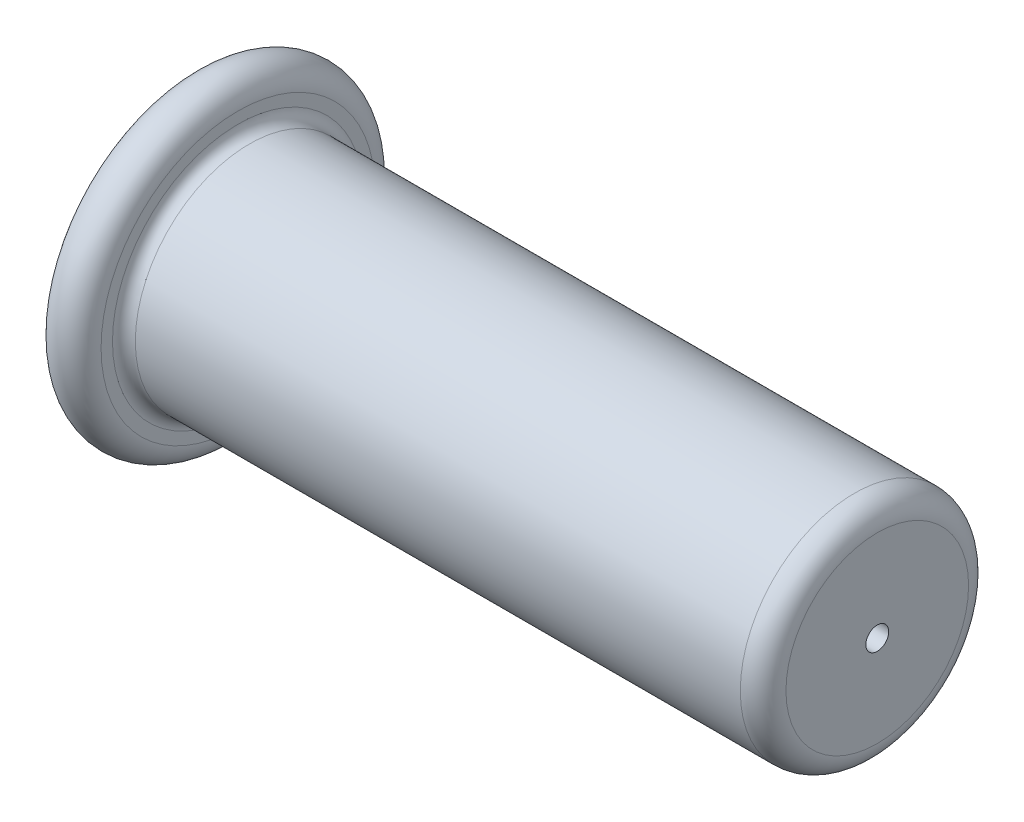
ISO-10303-21;
HEADER;
FILE_DESCRIPTION(('STEP AP214'),'2;1');
FILE_NAME('part.step','',(''),(''),'','','');
FILE_SCHEMA(('AUTOMOTIVE_DESIGN { 1 0 10303 214 1 1 1 1 }'));
ENDSEC;
DATA;
#1=APPLICATION_CONTEXT('core data for automotive mechanical design processes');
#2=APPLICATION_PROTOCOL_DEFINITION('international standard','automotive_design',2000,#1);
#3=PRODUCT_CONTEXT('',#1,'mechanical');
#4=PRODUCT('Part','Part','',(#3));
#5=PRODUCT_RELATED_PRODUCT_CATEGORY('part','',(#4));
#6=PRODUCT_DEFINITION_FORMATION('','',#4);
#7=PRODUCT_DEFINITION_CONTEXT('part definition',#1,'design');
#8=PRODUCT_DEFINITION('design','',#6,#7);
#9=PRODUCT_DEFINITION_SHAPE('','',#8);
#10=(LENGTH_UNIT() NAMED_UNIT(*) SI_UNIT(.MILLI.,.METRE.));
#11=(NAMED_UNIT(*) PLANE_ANGLE_UNIT() SI_UNIT($,.RADIAN.));
#12=(NAMED_UNIT(*) SI_UNIT($,.STERADIAN.) SOLID_ANGLE_UNIT());
#13=UNCERTAINTY_MEASURE_WITH_UNIT(LENGTH_MEASURE(1.E-05),#10,'distance_accuracy_value','');
#14=(GEOMETRIC_REPRESENTATION_CONTEXT(3) GLOBAL_UNCERTAINTY_ASSIGNED_CONTEXT((#13)) GLOBAL_UNIT_ASSIGNED_CONTEXT((#10,
#11,#12)) REPRESENTATION_CONTEXT('',''));
#15=CARTESIAN_POINT('',(0.,0.,0.));
#16=DIRECTION('',(0.,0.,1.));
#17=DIRECTION('',(1.,0.,0.));
#18=AXIS2_PLACEMENT_3D('',#15,#16,#17);
#19=CARTESIAN_POINT('',(10.,0.,0.));
#20=DIRECTION('',(-1.,0.,0.));
#21=DIRECTION('',(0.,0.,1.));
#22=AXIS2_PLACEMENT_3D('',#19,#20,#21);
#23=TOROIDAL_SURFACE('',#22,22.,2.);
#24=CARTESIAN_POINT('',(9.99999999999999,0.,0.));
#25=DIRECTION('',(-1.,0.,0.));
#26=DIRECTION('',(0.,0.,1.));
#27=AXIS2_PLACEMENT_3D('',#24,#25,#26);
#28=CIRCLE('',#27,20.);
#29=CARTESIAN_POINT('',(9.99999999999999,0.,20.));
#30=VERTEX_POINT('',#29);
#31=EDGE_CURVE('E71',#30,#30,#28,.T.);
#32=ORIENTED_EDGE('',*,*,#31,.T.);
#33=EDGE_LOOP('',(#32));
#34=FACE_BOUND('',#33,.T.);
#35=CARTESIAN_POINT('',(7.99999999999999,0.,0.));
#36=DIRECTION('',(-1.,0.,0.));
#37=DIRECTION('',(0.,0.,1.));
#38=AXIS2_PLACEMENT_3D('',#35,#36,#37);
#39=CIRCLE('',#38,22.);
#40=CARTESIAN_POINT('',(7.99999999999999,0.,22.));
#41=VERTEX_POINT('',#40);
#42=EDGE_CURVE('E10',#41,#41,#39,.T.);
#43=ORIENTED_EDGE('',*,*,#42,.F.);
#44=EDGE_LOOP('',(#43));
#45=FACE_BOUND('',#44,.T.);
#46=ADVANCED_FACE('F34',(#34,#45),#23,.F.);
#47=CARTESIAN_POINT('',(7.99999999999999,0.,0.));
#48=DIRECTION('',(1.,0.,0.));
#49=DIRECTION('',(0.,0.,-1.));
#50=AXIS2_PLACEMENT_3D('',#47,#48,#49);
#51=PLANE('',#50);
#52=ORIENTED_EDGE('',*,*,#42,.T.);
#53=EDGE_LOOP('',(#52));
#54=FACE_BOUND('',#53,.T.);
#55=CARTESIAN_POINT('',(7.99999999999999,0.,0.));
#56=DIRECTION('',(-1.,0.,0.));
#57=DIRECTION('',(0.,0.,1.));
#58=AXIS2_PLACEMENT_3D('',#55,#56,#57);
#59=CIRCLE('',#58,24.);
#60=CARTESIAN_POINT('',(7.99999999999999,0.,24.));
#61=VERTEX_POINT('',#60);
#62=EDGE_CURVE('E40',#61,#61,#59,.T.);
#63=ORIENTED_EDGE('',*,*,#62,.F.);
#64=EDGE_LOOP('',(#63));
#65=FACE_BOUND('',#64,.T.);
#66=ADVANCED_FACE('F107',(#54,#65),#51,.T.);
#67=CARTESIAN_POINT('',(4.,0.,0.));
#68=DIRECTION('',(-1.,0.,0.));
#69=DIRECTION('',(0.,0.,1.));
#70=AXIS2_PLACEMENT_3D('',#67,#68,#69);
#71=TOROIDAL_SURFACE('',#70,24.,4.);
#72=ORIENTED_EDGE('',*,*,#62,.T.);
#73=EDGE_LOOP('',(#72));
#74=FACE_BOUND('',#73,.T.);
#75=CARTESIAN_POINT('',(0.,0.,0.));
#76=DIRECTION('',(-1.,0.,0.));
#77=DIRECTION('',(0.,0.,1.));
#78=AXIS2_PLACEMENT_3D('',#75,#76,#77);
#79=CIRCLE('',#78,24.);
#80=CARTESIAN_POINT('',(0.,0.,24.));
#81=VERTEX_POINT('',#80);
#82=EDGE_CURVE('E44',#81,#81,#79,.T.);
#83=ORIENTED_EDGE('',*,*,#82,.F.);
#84=EDGE_LOOP('',(#83));
#85=FACE_BOUND('',#84,.T.);
#86=ADVANCED_FACE('F111',(#74,#85),#71,.T.);
#87=CARTESIAN_POINT('',(0.,0.,0.));
#88=DIRECTION('',(-1.,0.,0.));
#89=DIRECTION('',(0.,0.,1.));
#90=AXIS2_PLACEMENT_3D('',#87,#88,#89);
#91=PLANE('',#90);
#92=ORIENTED_EDGE('',*,*,#82,.T.);
#93=EDGE_LOOP('',(#92));
#94=FACE_BOUND('',#93,.T.);
#95=CARTESIAN_POINT('',(0.,0.,0.));
#96=DIRECTION('',(-1.,0.,0.));
#97=DIRECTION('',(0.,0.,1.));
#98=AXIS2_PLACEMENT_3D('',#95,#96,#97);
#99=CIRCLE('',#98,13.);
#100=CARTESIAN_POINT('',(0.,0.,13.));
#101=VERTEX_POINT('',#100);
#102=EDGE_CURVE('E48',#101,#101,#99,.T.);
#103=ORIENTED_EDGE('',*,*,#102,.F.);
#104=EDGE_LOOP('',(#103));
#105=FACE_BOUND('',#104,.T.);
#106=ADVANCED_FACE('F115',(#94,#105),#91,.T.);
#107=CARTESIAN_POINT('',(1.,0.,0.));
#108=DIRECTION('',(-1.,0.,0.));
#109=DIRECTION('',(0.,0.,1.));
#110=AXIS2_PLACEMENT_3D('',#107,#108,#109);
#111=CONICAL_SURFACE('',#110,12.,0.785398163397448);
#112=ORIENTED_EDGE('',*,*,#102,.T.);
#113=EDGE_LOOP('',(#112));
#114=FACE_BOUND('',#113,.T.);
#115=CARTESIAN_POINT('',(1.,0.,0.));
#116=DIRECTION('',(-1.,0.,0.));
#117=DIRECTION('',(0.,0.,1.));
#118=AXIS2_PLACEMENT_3D('',#115,#116,#117);
#119=CIRCLE('',#118,12.);
#120=CARTESIAN_POINT('',(1.,0.,12.));
#121=VERTEX_POINT('',#120);
#122=EDGE_CURVE('E53',#121,#121,#119,.T.);
#123=ORIENTED_EDGE('',*,*,#122,.F.);
#124=EDGE_LOOP('',(#123));
#125=FACE_BOUND('',#124,.T.);
#126=ADVANCED_FACE('F121',(#114,#125),#111,.F.);
#127=CARTESIAN_POINT('',(0.,0.,0.));
#128=DIRECTION('',(-1.,0.,0.));
#129=DIRECTION('',(0.,0.,1.));
#130=AXIS2_PLACEMENT_3D('',#127,#128,#129);
#131=CYLINDRICAL_SURFACE('',#130,12.);
#132=CARTESIAN_POINT('',(60.,0.,0.));
#133=DIRECTION('',(-1.,0.,0.));
#134=DIRECTION('',(0.,0.,1.));
#135=AXIS2_PLACEMENT_3D('',#132,#133,#134);
#136=CIRCLE('',#135,12.);
#137=CARTESIAN_POINT('',(60.,0.,12.));
#138=VERTEX_POINT('',#137);
#139=EDGE_CURVE('E56',#138,#138,#136,.T.);
#140=ORIENTED_EDGE('',*,*,#139,.F.);
#141=EDGE_LOOP('',(#140));
#142=FACE_BOUND('',#141,.T.);
#143=ORIENTED_EDGE('',*,*,#122,.T.);
#144=EDGE_LOOP('',(#143));
#145=FACE_BOUND('',#144,.T.);
#146=ADVANCED_FACE('F103',(#142,#145),#131,.F.);
#147=CARTESIAN_POINT('',(60.,0.,0.));
#148=DIRECTION('',(-1.,0.,0.));
#149=DIRECTION('',(0.,0.,1.));
#150=AXIS2_PLACEMENT_3D('',#147,#148,#149);
#151=PLANE('',#150);
#152=ORIENTED_EDGE('',*,*,#139,.T.);
#153=EDGE_LOOP('',(#152));
#154=FACE_BOUND('',#153,.T.);
#155=CARTESIAN_POINT('',(60.,0.,0.));
#156=DIRECTION('',(-1.,0.,0.));
#157=DIRECTION('',(0.,0.,1.));
#158=AXIS2_PLACEMENT_3D('',#155,#156,#157);
#159=CIRCLE('',#158,2.);
#160=CARTESIAN_POINT('',(60.,0.,2.));
#161=VERTEX_POINT('',#160);
#162=EDGE_CURVE('E59',#161,#161,#159,.T.);
#163=ORIENTED_EDGE('',*,*,#162,.F.);
#164=EDGE_LOOP('',(#163));
#165=FACE_BOUND('',#164,.T.);
#166=ADVANCED_FACE('F97',(#154,#165),#151,.T.);
#167=CARTESIAN_POINT('',(0.,0.,0.));
#168=DIRECTION('',(-1.,0.,0.));
#169=DIRECTION('',(0.,0.,1.));
#170=AXIS2_PLACEMENT_3D('',#167,#168,#169);
#171=CYLINDRICAL_SURFACE('',#170,2.);
#172=ORIENTED_EDGE('',*,*,#162,.T.);
#173=EDGE_LOOP('',(#172));
#174=FACE_BOUND('',#173,.T.);
#175=CARTESIAN_POINT('',(120.,0.,0.));
#176=DIRECTION('',(-1.,0.,0.));
#177=DIRECTION('',(0.,0.,1.));
#178=AXIS2_PLACEMENT_3D('',#175,#176,#177);
#179=CIRCLE('',#178,2.);
#180=CARTESIAN_POINT('',(120.,0.,2.));
#181=VERTEX_POINT('',#180);
#182=EDGE_CURVE('E62',#181,#181,#179,.T.);
#183=ORIENTED_EDGE('',*,*,#182,.F.);
#184=EDGE_LOOP('',(#183));
#185=FACE_BOUND('',#184,.T.);
#186=ADVANCED_FACE('F92',(#174,#185),#171,.F.);
#187=CARTESIAN_POINT('',(120.,0.,0.));
#188=DIRECTION('',(-1.,0.,0.));
#189=DIRECTION('',(0.,0.,1.));
#190=AXIS2_PLACEMENT_3D('',#187,#188,#189);
#191=PLANE('',#190);
#192=CARTESIAN_POINT('',(120.,0.,0.));
#193=DIRECTION('',(-1.,0.,0.));
#194=DIRECTION('',(0.,0.,1.));
#195=AXIS2_PLACEMENT_3D('',#192,#193,#194);
#196=CIRCLE('',#195,16.);
#197=CARTESIAN_POINT('',(120.,0.,16.));
#198=VERTEX_POINT('',#197);
#199=EDGE_CURVE('E65',#198,#198,#196,.T.);
#200=ORIENTED_EDGE('',*,*,#199,.F.);
#201=EDGE_LOOP('',(#200));
#202=FACE_BOUND('',#201,.T.);
#203=ORIENTED_EDGE('',*,*,#182,.T.);
#204=EDGE_LOOP('',(#203));
#205=FACE_BOUND('',#204,.T.);
#206=ADVANCED_FACE('F86',(#202,#205),#191,.F.);
#207=CARTESIAN_POINT('',(116.,0.,0.));
#208=DIRECTION('',(-1.,0.,0.));
#209=DIRECTION('',(0.,0.,1.));
#210=AXIS2_PLACEMENT_3D('',#207,#208,#209);
#211=TOROIDAL_SURFACE('',#210,16.,4.);
#212=CARTESIAN_POINT('',(116.,0.,0.));
#213=DIRECTION('',(-1.,0.,0.));
#214=DIRECTION('',(0.,0.,1.));
#215=AXIS2_PLACEMENT_3D('',#212,#213,#214);
#216=CIRCLE('',#215,20.);
#217=CARTESIAN_POINT('',(116.,0.,20.));
#218=VERTEX_POINT('',#217);
#219=EDGE_CURVE('E68',#218,#218,#216,.T.);
#220=ORIENTED_EDGE('',*,*,#219,.F.);
#221=EDGE_LOOP('',(#220));
#222=FACE_BOUND('',#221,.T.);
#223=ORIENTED_EDGE('',*,*,#199,.T.);
#224=EDGE_LOOP('',(#223));
#225=FACE_BOUND('',#224,.T.);
#226=ADVANCED_FACE('F80',(#222,#225),#211,.T.);
#227=CARTESIAN_POINT('',(0.,0.,0.));
#228=DIRECTION('',(-1.,0.,0.));
#229=DIRECTION('',(0.,0.,1.));
#230=AXIS2_PLACEMENT_3D('',#227,#228,#229);
#231=CYLINDRICAL_SURFACE('',#230,20.);
#232=ORIENTED_EDGE('',*,*,#31,.F.);
#233=EDGE_LOOP('',(#232));
#234=FACE_BOUND('',#233,.T.);
#235=ORIENTED_EDGE('',*,*,#219,.T.);
#236=EDGE_LOOP('',(#235));
#237=FACE_BOUND('',#236,.T.);
#238=ADVANCED_FACE('F77',(#234,#237),#231,.T.);
#239=CLOSED_SHELL('',(#46,#66,#86,#106,#126,#146,#166,#186,#206,#226,#238));
#240=MANIFOLD_SOLID_BREP('B2',#239);
#241=ADVANCED_BREP_SHAPE_REPRESENTATION('',(#18,#240),#14);
#242=SHAPE_DEFINITION_REPRESENTATION(#9,#241);
ENDSEC;
END-ISO-10303-21;
